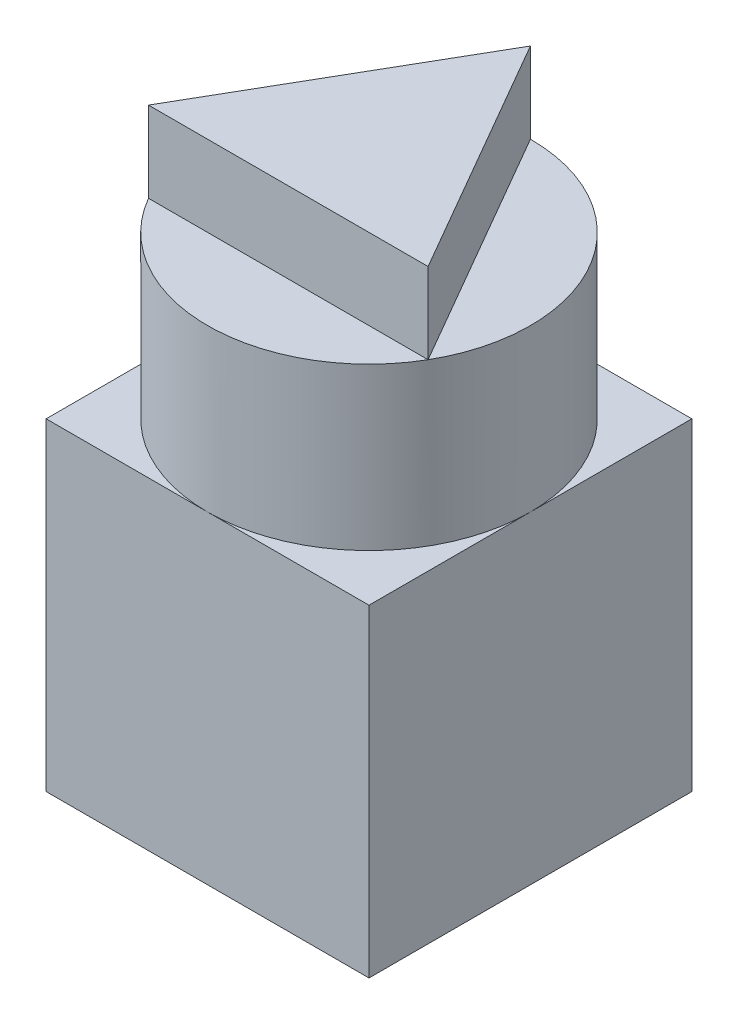
ISO-10303-21;
HEADER;
FILE_DESCRIPTION(('STEP AP214'),'2;1');
FILE_NAME('part.step','',(''),(''),'','','');
FILE_SCHEMA(('AUTOMOTIVE_DESIGN { 1 0 10303 214 1 1 1 1 }'));
ENDSEC;
DATA;
#1=APPLICATION_CONTEXT('core data for automotive mechanical design processes');
#2=APPLICATION_PROTOCOL_DEFINITION('international standard','automotive_design',2000,#1);
#3=PRODUCT_CONTEXT('',#1,'mechanical');
#4=PRODUCT('Part','Part','',(#3));
#5=PRODUCT_RELATED_PRODUCT_CATEGORY('part','',(#4));
#6=PRODUCT_DEFINITION_FORMATION('','',#4);
#7=PRODUCT_DEFINITION_CONTEXT('part definition',#1,'design');
#8=PRODUCT_DEFINITION('design','',#6,#7);
#9=PRODUCT_DEFINITION_SHAPE('','',#8);
#10=(LENGTH_UNIT() NAMED_UNIT(*) SI_UNIT(.MILLI.,.METRE.));
#11=(NAMED_UNIT(*) PLANE_ANGLE_UNIT() SI_UNIT($,.RADIAN.));
#12=(NAMED_UNIT(*) SI_UNIT($,.STERADIAN.) SOLID_ANGLE_UNIT());
#13=UNCERTAINTY_MEASURE_WITH_UNIT(LENGTH_MEASURE(1.E-05),#10,'distance_accuracy_value','');
#14=(GEOMETRIC_REPRESENTATION_CONTEXT(3) GLOBAL_UNCERTAINTY_ASSIGNED_CONTEXT((#13)) GLOBAL_UNIT_ASSIGNED_CONTEXT((#10,
#11,#12)) REPRESENTATION_CONTEXT('',''));
#15=CARTESIAN_POINT('',(0.,0.,0.));
#16=DIRECTION('',(0.,0.,1.));
#17=DIRECTION('',(1.,0.,0.));
#18=AXIS2_PLACEMENT_3D('',#15,#16,#17);
#19=CARTESIAN_POINT('',(0.,300.,0.));
#20=DIRECTION('',(0.,1.,0.));
#21=DIRECTION('',(0.,0.,1.));
#22=AXIS2_PLACEMENT_3D('',#19,#20,#21);
#23=PLANE('',#22);
#24=DIRECTION('',(-0.5,0.,-0.866025403784439));
#25=VECTOR('',#24,1.);
#26=CARTESIAN_POINT('',(86.6025403784439,300.,50.));
#27=LINE('',#26,#25);
#28=CARTESIAN_POINT('',(86.6025403784439,300.,50.));
#29=VERTEX_POINT('',#28);
#30=CARTESIAN_POINT('',(0.,300.,-100.));
#31=VERTEX_POINT('',#30);
#32=EDGE_CURVE('E68',#29,#31,#27,.T.);
#33=ORIENTED_EDGE('',*,*,#32,.F.);
#34=CARTESIAN_POINT('',(0.,300.,0.));
#35=DIRECTION('',(0.,1.,0.));
#36=DIRECTION('',(0.,0.,1.));
#37=AXIS2_PLACEMENT_3D('',#34,#35,#36);
#38=CIRCLE('',#37,100.);
#39=EDGE_CURVE('E152',#29,#31,#38,.T.);
#40=ORIENTED_EDGE('',*,*,#39,.T.);
#41=EDGE_LOOP('',(#33,#40));
#42=FACE_BOUND('',#41,.T.);
#43=ADVANCED_FACE('F43',(#42),#23,.T.);
#44=DIRECTION('',(1.,0.,0.));
#45=VECTOR('',#44,1.);
#46=CARTESIAN_POINT('',(-86.6025403784439,300.,50.));
#47=LINE('',#46,#45);
#48=CARTESIAN_POINT('',(-86.6025403784439,300.,50.));
#49=VERTEX_POINT('',#48);
#50=EDGE_CURVE('E138',#49,#29,#47,.T.);
#51=ORIENTED_EDGE('',*,*,#50,.F.);
#52=EDGE_CURVE('E146',#49,#29,#38,.T.);
#53=ORIENTED_EDGE('',*,*,#52,.T.);
#54=EDGE_LOOP('',(#51,#53));
#55=FACE_BOUND('',#54,.T.);
#56=ADVANCED_FACE('F230',(#55),#23,.T.);
#57=CARTESIAN_POINT('',(0.,200.,0.));
#58=DIRECTION('',(0.,-1.,0.));
#59=DIRECTION('',(0.,0.,-1.));
#60=AXIS2_PLACEMENT_3D('',#57,#58,#59);
#61=PLANE('',#60);
#62=CARTESIAN_POINT('',(0.,200.,0.));
#63=DIRECTION('',(0.,1.,0.));
#64=DIRECTION('',(0.,0.,1.));
#65=AXIS2_PLACEMENT_3D('',#62,#63,#64);
#66=CIRCLE('',#65,100.);
#67=CARTESIAN_POINT('',(0.,200.,100.));
#68=VERTEX_POINT('',#67);
#69=CARTESIAN_POINT('',(100.,200.,0.));
#70=VERTEX_POINT('',#69);
#71=EDGE_CURVE('E55',#68,#70,#66,.T.);
#72=ORIENTED_EDGE('',*,*,#71,.F.);
#73=DIRECTION('',(1.,0.,0.));
#74=VECTOR('',#73,1.);
#75=CARTESIAN_POINT('',(-100.,200.,100.));
#76=LINE('',#75,#74);
#77=CARTESIAN_POINT('',(100.,200.,100.));
#78=VERTEX_POINT('',#77);
#79=EDGE_CURVE('E172',#68,#78,#76,.T.);
#80=ORIENTED_EDGE('',*,*,#79,.T.);
#81=DIRECTION('',(0.,0.,-1.));
#82=VECTOR('',#81,1.);
#83=CARTESIAN_POINT('',(100.,200.,100.));
#84=LINE('',#83,#82);
#85=EDGE_CURVE('E157',#78,#70,#84,.T.);
#86=ORIENTED_EDGE('',*,*,#85,.T.);
#87=EDGE_LOOP('',(#72,#80,#86));
#88=FACE_BOUND('',#87,.T.);
#89=ADVANCED_FACE('F258',(#88),#61,.F.);
#90=CARTESIAN_POINT('',(0.,200.,-100.));
#91=VERTEX_POINT('',#90);
#92=EDGE_CURVE('E11',#70,#91,#66,.T.);
#93=ORIENTED_EDGE('',*,*,#92,.F.);
#94=CARTESIAN_POINT('',(100.,200.,-100.));
#95=VERTEX_POINT('',#94);
#96=EDGE_CURVE('E162',#70,#95,#84,.T.);
#97=ORIENTED_EDGE('',*,*,#96,.T.);
#98=DIRECTION('',(-1.,0.,0.));
#99=VECTOR('',#98,1.);
#100=CARTESIAN_POINT('',(-100.,200.,-100.));
#101=LINE('',#100,#99);
#102=EDGE_CURVE('E163',#95,#91,#101,.T.);
#103=ORIENTED_EDGE('',*,*,#102,.T.);
#104=EDGE_LOOP('',(#93,#97,#103));
#105=FACE_BOUND('',#104,.T.);
#106=ADVANCED_FACE('F219',(#105),#61,.F.);
#107=CARTESIAN_POINT('',(-100.,200.,0.));
#108=VERTEX_POINT('',#107);
#109=EDGE_CURVE('E53',#91,#108,#66,.T.);
#110=ORIENTED_EDGE('',*,*,#109,.F.);
#111=CARTESIAN_POINT('',(-100.,200.,-100.));
#112=VERTEX_POINT('',#111);
#113=EDGE_CURVE('E161',#91,#112,#101,.T.);
#114=ORIENTED_EDGE('',*,*,#113,.T.);
#115=DIRECTION('',(0.,0.,1.));
#116=VECTOR('',#115,1.);
#117=CARTESIAN_POINT('',(-100.,200.,100.));
#118=LINE('',#117,#116);
#119=EDGE_CURVE('E168',#112,#108,#118,.T.);
#120=ORIENTED_EDGE('',*,*,#119,.T.);
#121=EDGE_LOOP('',(#110,#114,#120));
#122=FACE_BOUND('',#121,.T.);
#123=ADVANCED_FACE('F215',(#122),#61,.F.);
#124=CARTESIAN_POINT('',(100.,200.,100.));
#125=DIRECTION('',(-1.,0.,0.));
#126=DIRECTION('',(0.,0.,1.));
#127=AXIS2_PLACEMENT_3D('',#124,#125,#126);
#128=PLANE('',#127);
#129=DIRECTION('',(0.,0.,-1.));
#130=VECTOR('',#129,1.);
#131=CARTESIAN_POINT('',(100.,0.,100.));
#132=LINE('',#131,#130);
#133=CARTESIAN_POINT('',(100.,0.,100.));
#134=VERTEX_POINT('',#133);
#135=CARTESIAN_POINT('',(100.,0.,-100.));
#136=VERTEX_POINT('',#135);
#137=EDGE_CURVE('E154',#134,#136,#132,.T.);
#138=ORIENTED_EDGE('',*,*,#137,.T.);
#139=DIRECTION('',(0.,-1.,0.));
#140=VECTOR('',#139,1.);
#141=CARTESIAN_POINT('',(100.,200.,-100.));
#142=LINE('',#141,#140);
#143=EDGE_CURVE('E47',#95,#136,#142,.T.);
#144=ORIENTED_EDGE('',*,*,#143,.F.);
#145=ORIENTED_EDGE('',*,*,#96,.F.);
#146=ORIENTED_EDGE('',*,*,#85,.F.);
#147=DIRECTION('',(0.,-1.,0.));
#148=VECTOR('',#147,1.);
#149=CARTESIAN_POINT('',(100.,200.,100.));
#150=LINE('',#149,#148);
#151=EDGE_CURVE('E176',#78,#134,#150,.T.);
#152=ORIENTED_EDGE('',*,*,#151,.T.);
#153=EDGE_LOOP('',(#138,#144,#145,#146,#152));
#154=FACE_BOUND('',#153,.T.);
#155=ADVANCED_FACE('F45',(#154),#128,.F.);
#156=CARTESIAN_POINT('',(-100.,200.,-100.));
#157=DIRECTION('',(0.,0.,1.));
#158=DIRECTION('',(1.,0.,0.));
#159=AXIS2_PLACEMENT_3D('',#156,#157,#158);
#160=PLANE('',#159);
#161=DIRECTION('',(-1.,0.,0.));
#162=VECTOR('',#161,1.);
#163=CARTESIAN_POINT('',(-100.,0.,-100.));
#164=LINE('',#163,#162);
#165=CARTESIAN_POINT('',(-100.,0.,-100.));
#166=VERTEX_POINT('',#165);
#167=EDGE_CURVE('E180',#136,#166,#164,.T.);
#168=ORIENTED_EDGE('',*,*,#167,.T.);
#169=DIRECTION('',(0.,-1.,0.));
#170=VECTOR('',#169,1.);
#171=CARTESIAN_POINT('',(-100.,200.,-100.));
#172=LINE('',#171,#170);
#173=EDGE_CURVE('E195',#112,#166,#172,.T.);
#174=ORIENTED_EDGE('',*,*,#173,.F.);
#175=ORIENTED_EDGE('',*,*,#113,.F.);
#176=ORIENTED_EDGE('',*,*,#102,.F.);
#177=ORIENTED_EDGE('',*,*,#143,.T.);
#178=EDGE_LOOP('',(#168,#174,#175,#176,#177));
#179=FACE_BOUND('',#178,.T.);
#180=ADVANCED_FACE('F216',(#179),#160,.F.);
#181=CARTESIAN_POINT('',(-100.,200.,100.));
#182=DIRECTION('',(1.,0.,0.));
#183=DIRECTION('',(0.,0.,-1.));
#184=AXIS2_PLACEMENT_3D('',#181,#182,#183);
#185=PLANE('',#184);
#186=DIRECTION('',(0.,0.,1.));
#187=VECTOR('',#186,1.);
#188=CARTESIAN_POINT('',(-100.,0.,100.));
#189=LINE('',#188,#187);
#190=CARTESIAN_POINT('',(-100.,0.,100.));
#191=VERTEX_POINT('',#190);
#192=EDGE_CURVE('E183',#166,#191,#189,.T.);
#193=ORIENTED_EDGE('',*,*,#192,.T.);
#194=DIRECTION('',(0.,-1.,0.));
#195=VECTOR('',#194,1.);
#196=CARTESIAN_POINT('',(-100.,200.,100.));
#197=LINE('',#196,#195);
#198=CARTESIAN_POINT('',(-100.,200.,100.));
#199=VERTEX_POINT('',#198);
#200=EDGE_CURVE('E192',#199,#191,#197,.T.);
#201=ORIENTED_EDGE('',*,*,#200,.F.);
#202=EDGE_CURVE('E167',#108,#199,#118,.T.);
#203=ORIENTED_EDGE('',*,*,#202,.F.);
#204=ORIENTED_EDGE('',*,*,#119,.F.);
#205=ORIENTED_EDGE('',*,*,#173,.T.);
#206=EDGE_LOOP('',(#193,#201,#203,#204,#205));
#207=FACE_BOUND('',#206,.T.);
#208=ADVANCED_FACE('F280',(#207),#185,.F.);
#209=CARTESIAN_POINT('',(-100.,200.,100.));
#210=DIRECTION('',(0.,0.,-1.));
#211=DIRECTION('',(-1.,0.,0.));
#212=AXIS2_PLACEMENT_3D('',#209,#210,#211);
#213=PLANE('',#212);
#214=DIRECTION('',(1.,0.,0.));
#215=VECTOR('',#214,1.);
#216=CARTESIAN_POINT('',(-100.,0.,100.));
#217=LINE('',#216,#215);
#218=EDGE_CURVE('E186',#191,#134,#217,.T.);
#219=ORIENTED_EDGE('',*,*,#218,.T.);
#220=ORIENTED_EDGE('',*,*,#151,.F.);
#221=ORIENTED_EDGE('',*,*,#79,.F.);
#222=EDGE_CURVE('E173',#199,#68,#76,.T.);
#223=ORIENTED_EDGE('',*,*,#222,.F.);
#224=ORIENTED_EDGE('',*,*,#200,.T.);
#225=EDGE_LOOP('',(#219,#220,#221,#223,#224));
#226=FACE_BOUND('',#225,.T.);
#227=ADVANCED_FACE('F275',(#226),#213,.F.);
#228=EDGE_CURVE('E147',#108,#68,#66,.T.);
#229=ORIENTED_EDGE('',*,*,#228,.F.);
#230=ORIENTED_EDGE('',*,*,#202,.T.);
#231=ORIENTED_EDGE('',*,*,#222,.T.);
#232=EDGE_LOOP('',(#229,#230,#231));
#233=FACE_BOUND('',#232,.T.);
#234=ADVANCED_FACE('F270',(#233),#61,.F.);
#235=CARTESIAN_POINT('',(0.,0.,0.));
#236=DIRECTION('',(0.,-1.,0.));
#237=DIRECTION('',(0.,0.,-1.));
#238=AXIS2_PLACEMENT_3D('',#235,#236,#237);
#239=PLANE('',#238);
#240=ORIENTED_EDGE('',*,*,#137,.F.);
#241=ORIENTED_EDGE('',*,*,#218,.F.);
#242=ORIENTED_EDGE('',*,*,#192,.F.);
#243=ORIENTED_EDGE('',*,*,#167,.F.);
#244=EDGE_LOOP('',(#240,#241,#242,#243));
#245=FACE_BOUND('',#244,.T.);
#246=ADVANCED_FACE('F266',(#245),#239,.T.);
#247=CARTESIAN_POINT('',(0.,300.,0.));
#248=DIRECTION('',(0.,-1.,0.));
#249=DIRECTION('',(0.,0.,-1.));
#250=AXIS2_PLACEMENT_3D('',#247,#248,#249);
#251=CYLINDRICAL_SURFACE('',#250,100.);
#252=ORIENTED_EDGE('',*,*,#39,.F.);
#253=ORIENTED_EDGE('',*,*,#52,.F.);
#254=EDGE_CURVE('E155',#31,#49,#38,.T.);
#255=ORIENTED_EDGE('',*,*,#254,.F.);
#256=EDGE_LOOP('',(#252,#253,#255));
#257=FACE_BOUND('',#256,.T.);
#258=ORIENTED_EDGE('',*,*,#71,.T.);
#259=ORIENTED_EDGE('',*,*,#92,.T.);
#260=ORIENTED_EDGE('',*,*,#109,.T.);
#261=ORIENTED_EDGE('',*,*,#228,.T.);
#262=EDGE_LOOP('',(#258,#259,#260,#261));
#263=FACE_BOUND('',#262,.T.);
#264=ADVANCED_FACE('F212',(#257,#263),#251,.T.);
#265=DIRECTION('',(-0.5,0.,0.866025403784439));
#266=VECTOR('',#265,1.);
#267=CARTESIAN_POINT('',(0.,300.,-100.));
#268=LINE('',#267,#266);
#269=EDGE_CURVE('E61',#31,#49,#268,.T.);
#270=ORIENTED_EDGE('',*,*,#269,.F.);
#271=ORIENTED_EDGE('',*,*,#254,.T.);
#272=EDGE_LOOP('',(#270,#271));
#273=FACE_BOUND('',#272,.T.);
#274=ADVANCED_FACE('F254',(#273),#23,.T.);
#275=CARTESIAN_POINT('',(86.6025403784439,350.,50.));
#276=DIRECTION('',(-0.866025403784439,0.,0.5));
#277=DIRECTION('',(0.5,0.,0.866025403784439));
#278=AXIS2_PLACEMENT_3D('',#275,#276,#277);
#279=PLANE('',#278);
#280=ORIENTED_EDGE('',*,*,#32,.T.);
#281=DIRECTION('',(0.,-1.,0.));
#282=VECTOR('',#281,1.);
#283=CARTESIAN_POINT('',(0.,350.,-100.));
#284=LINE('',#283,#282);
#285=CARTESIAN_POINT('',(0.,350.,-100.));
#286=VERTEX_POINT('',#285);
#287=EDGE_CURVE('E123',#286,#31,#284,.T.);
#288=ORIENTED_EDGE('',*,*,#287,.F.);
#289=DIRECTION('',(-0.5,0.,-0.866025403784439));
#290=VECTOR('',#289,1.);
#291=CARTESIAN_POINT('',(86.6025403784439,350.,50.));
#292=LINE('',#291,#290);
#293=CARTESIAN_POINT('',(86.6025403784439,350.,50.));
#294=VERTEX_POINT('',#293);
#295=EDGE_CURVE('E130',#294,#286,#292,.T.);
#296=ORIENTED_EDGE('',*,*,#295,.F.);
#297=DIRECTION('',(0.,-1.,0.));
#298=VECTOR('',#297,1.);
#299=CARTESIAN_POINT('',(86.6025403784439,350.,50.));
#300=LINE('',#299,#298);
#301=EDGE_CURVE('E148',#294,#29,#300,.T.);
#302=ORIENTED_EDGE('',*,*,#301,.T.);
#303=EDGE_LOOP('',(#280,#288,#296,#302));
#304=FACE_BOUND('',#303,.T.);
#305=ADVANCED_FACE('F140',(#304),#279,.F.);
#306=CARTESIAN_POINT('',(0.,350.,-100.));
#307=DIRECTION('',(0.866025403784439,0.,0.5));
#308=DIRECTION('',(0.5,0.,-0.866025403784439));
#309=AXIS2_PLACEMENT_3D('',#306,#307,#308);
#310=PLANE('',#309);
#311=ORIENTED_EDGE('',*,*,#269,.T.);
#312=DIRECTION('',(0.,-1.,0.));
#313=VECTOR('',#312,1.);
#314=CARTESIAN_POINT('',(-86.6025403784439,350.,50.));
#315=LINE('',#314,#313);
#316=CARTESIAN_POINT('',(-86.6025403784439,350.,50.));
#317=VERTEX_POINT('',#316);
#318=EDGE_CURVE('E125',#317,#49,#315,.T.);
#319=ORIENTED_EDGE('',*,*,#318,.F.);
#320=DIRECTION('',(-0.5,0.,0.866025403784439));
#321=VECTOR('',#320,1.);
#322=CARTESIAN_POINT('',(0.,350.,-100.));
#323=LINE('',#322,#321);
#324=EDGE_CURVE('E119',#286,#317,#323,.T.);
#325=ORIENTED_EDGE('',*,*,#324,.F.);
#326=ORIENTED_EDGE('',*,*,#287,.T.);
#327=EDGE_LOOP('',(#311,#319,#325,#326));
#328=FACE_BOUND('',#327,.T.);
#329=ADVANCED_FACE('F121',(#328),#310,.F.);
#330=CARTESIAN_POINT('',(-86.6025403784439,350.,50.));
#331=DIRECTION('',(0.,0.,-1.));
#332=DIRECTION('',(-1.,0.,0.));
#333=AXIS2_PLACEMENT_3D('',#330,#331,#332);
#334=PLANE('',#333);
#335=ORIENTED_EDGE('',*,*,#50,.T.);
#336=ORIENTED_EDGE('',*,*,#301,.F.);
#337=DIRECTION('',(1.,0.,0.));
#338=VECTOR('',#337,1.);
#339=CARTESIAN_POINT('',(-86.6025403784439,350.,50.));
#340=LINE('',#339,#338);
#341=EDGE_CURVE('E129',#317,#294,#340,.T.);
#342=ORIENTED_EDGE('',*,*,#341,.F.);
#343=ORIENTED_EDGE('',*,*,#318,.T.);
#344=EDGE_LOOP('',(#335,#336,#342,#343));
#345=FACE_BOUND('',#344,.T.);
#346=ADVANCED_FACE('F234',(#345),#334,.F.);
#347=CARTESIAN_POINT('',(0.,350.,0.));
#348=DIRECTION('',(0.,1.,0.));
#349=DIRECTION('',(0.,0.,1.));
#350=AXIS2_PLACEMENT_3D('',#347,#348,#349);
#351=PLANE('',#350);
#352=ORIENTED_EDGE('',*,*,#295,.T.);
#353=ORIENTED_EDGE('',*,*,#324,.T.);
#354=ORIENTED_EDGE('',*,*,#341,.T.);
#355=EDGE_LOOP('',(#352,#353,#354));
#356=FACE_BOUND('',#355,.T.);
#357=ADVANCED_FACE('F133',(#356),#351,.T.);
#358=CLOSED_SHELL('',(#43,#56,#89,#106,#123,#155,#180,#208,#227,#234,#246,#264,#274,#305,#329,
#346,#357));
#359=MANIFOLD_SOLID_BREP('B2',#358);
#360=ADVANCED_BREP_SHAPE_REPRESENTATION('',(#18,#359),#14);
#361=SHAPE_DEFINITION_REPRESENTATION(#9,#360);
ENDSEC;
END-ISO-10303-21;
